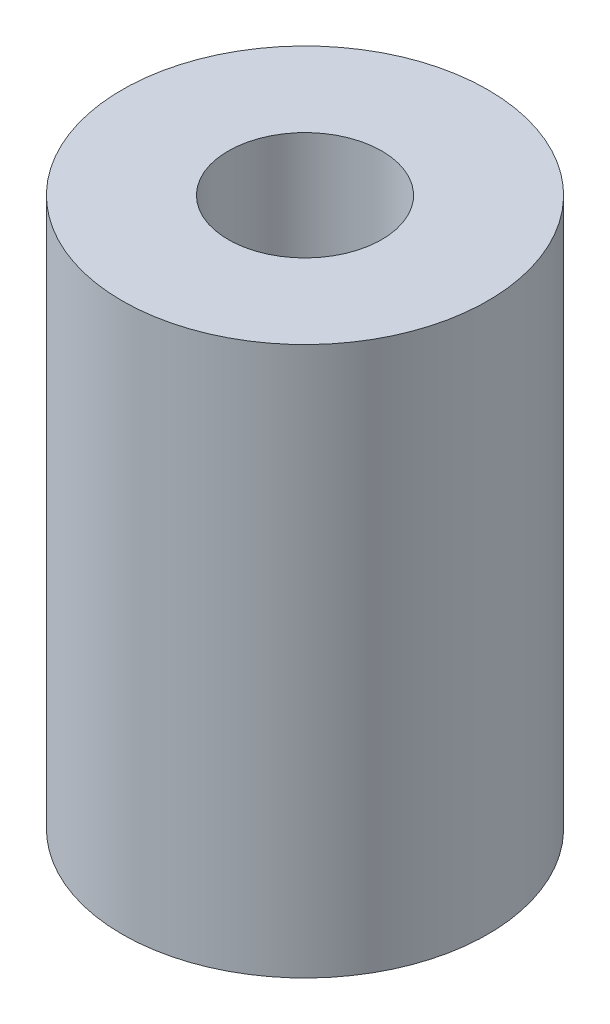
ISO-10303-21;
HEADER;
FILE_DESCRIPTION(('STEP AP214'),'2;1');
FILE_NAME('part.step','',(''),(''),'','','');
FILE_SCHEMA(('AUTOMOTIVE_DESIGN { 1 0 10303 214 1 1 1 1 }'));
ENDSEC;
DATA;
#1=APPLICATION_CONTEXT('core data for automotive mechanical design processes');
#2=APPLICATION_PROTOCOL_DEFINITION('international standard','automotive_design',2000,#1);
#3=PRODUCT_CONTEXT('',#1,'mechanical');
#4=PRODUCT('Part','Part','',(#3));
#5=PRODUCT_RELATED_PRODUCT_CATEGORY('part','',(#4));
#6=PRODUCT_DEFINITION_FORMATION('','',#4);
#7=PRODUCT_DEFINITION_CONTEXT('part definition',#1,'design');
#8=PRODUCT_DEFINITION('design','',#6,#7);
#9=PRODUCT_DEFINITION_SHAPE('','',#8);
#10=(LENGTH_UNIT() NAMED_UNIT(*) SI_UNIT(.MILLI.,.METRE.));
#11=(NAMED_UNIT(*) PLANE_ANGLE_UNIT() SI_UNIT($,.RADIAN.));
#12=(NAMED_UNIT(*) SI_UNIT($,.STERADIAN.) SOLID_ANGLE_UNIT());
#13=UNCERTAINTY_MEASURE_WITH_UNIT(LENGTH_MEASURE(1.E-05),#10,'distance_accuracy_value','');
#14=(GEOMETRIC_REPRESENTATION_CONTEXT(3) GLOBAL_UNCERTAINTY_ASSIGNED_CONTEXT((#13)) GLOBAL_UNIT_ASSIGNED_CONTEXT((#10,
#11,#12)) REPRESENTATION_CONTEXT('',''));
#15=CARTESIAN_POINT('',(0.,0.,0.));
#16=DIRECTION('',(0.,0.,1.));
#17=DIRECTION('',(1.,0.,0.));
#18=AXIS2_PLACEMENT_3D('',#15,#16,#17);
#19=CARTESIAN_POINT('',(0.,19.05,0.));
#20=DIRECTION('',(0.,1.,0.));
#21=DIRECTION('',(0.,0.,1.));
#22=AXIS2_PLACEMENT_3D('',#19,#20,#21);
#23=PLANE('',#22);
#24=CARTESIAN_POINT('',(0.,19.05,0.));
#25=DIRECTION('',(0.,1.,0.));
#26=DIRECTION('',(0.,0.,1.));
#27=AXIS2_PLACEMENT_3D('',#24,#25,#26);
#28=CIRCLE('',#27,6.35);
#29=CARTESIAN_POINT('',(0.,19.05,-6.35));
#30=VERTEX_POINT('',#29);
#31=EDGE_CURVE('E10',#30,#30,#28,.T.);
#32=ORIENTED_EDGE('',*,*,#31,.T.);
#33=EDGE_LOOP('',(#32));
#34=FACE_BOUND('',#33,.T.);
#35=CARTESIAN_POINT('',(0.,19.05,0.));
#36=DIRECTION('',(0.,1.,0.));
#37=DIRECTION('',(0.,0.,1.));
#38=AXIS2_PLACEMENT_3D('',#35,#36,#37);
#39=CIRCLE('',#38,2.667);
#40=CARTESIAN_POINT('',(0.,19.05,-2.667));
#41=VERTEX_POINT('',#40);
#42=EDGE_CURVE('E46',#41,#41,#39,.T.);
#43=ORIENTED_EDGE('',*,*,#42,.F.);
#44=EDGE_LOOP('',(#43));
#45=FACE_BOUND('',#44,.T.);
#46=ADVANCED_FACE('F35',(#34,#45),#23,.T.);
#47=CARTESIAN_POINT('',(0.,0.,0.));
#48=DIRECTION('',(0.,1.,0.));
#49=DIRECTION('',(0.,0.,1.));
#50=AXIS2_PLACEMENT_3D('',#47,#48,#49);
#51=PLANE('',#50);
#52=CARTESIAN_POINT('',(0.,0.,0.));
#53=DIRECTION('',(0.,1.,0.));
#54=DIRECTION('',(0.,0.,1.));
#55=AXIS2_PLACEMENT_3D('',#52,#53,#54);
#56=CIRCLE('',#55,6.35);
#57=CARTESIAN_POINT('',(0.,0.,-6.35));
#58=VERTEX_POINT('',#57);
#59=EDGE_CURVE('E39',#58,#58,#56,.T.);
#60=ORIENTED_EDGE('',*,*,#59,.F.);
#61=EDGE_LOOP('',(#60));
#62=FACE_BOUND('',#61,.T.);
#63=CARTESIAN_POINT('',(0.,0.,0.));
#64=DIRECTION('',(0.,1.,0.));
#65=DIRECTION('',(0.,0.,1.));
#66=AXIS2_PLACEMENT_3D('',#63,#64,#65);
#67=CIRCLE('',#66,2.667);
#68=CARTESIAN_POINT('',(0.,0.,-2.667));
#69=VERTEX_POINT('',#68);
#70=EDGE_CURVE('E48',#69,#69,#67,.T.);
#71=ORIENTED_EDGE('',*,*,#70,.T.);
#72=EDGE_LOOP('',(#71));
#73=FACE_BOUND('',#72,.T.);
#74=ADVANCED_FACE('F58',(#62,#73),#51,.F.);
#75=CARTESIAN_POINT('',(0.,19.05,0.));
#76=DIRECTION('',(0.,-1.,0.));
#77=DIRECTION('',(0.,0.,-1.));
#78=AXIS2_PLACEMENT_3D('',#75,#76,#77);
#79=CYLINDRICAL_SURFACE('',#78,6.35);
#80=CARTESIAN_POINT('',(0.,19.05,-6.35));
#81=CARTESIAN_POINT('',(0.,18.8515625,-6.35));
#82=CARTESIAN_POINT('',(0.,18.653125,-6.35));
#83=CARTESIAN_POINT('',(0.,18.25625,-6.35));
#84=CARTESIAN_POINT('',(0.,18.0578125,-6.35));
#85=CARTESIAN_POINT('',(0.,17.6609375,-6.35));
#86=CARTESIAN_POINT('',(0.,17.4625,-6.35));
#87=CARTESIAN_POINT('',(0.,17.065625,-6.35));
#88=CARTESIAN_POINT('',(0.,16.8671875,-6.35));
#89=CARTESIAN_POINT('',(0.,16.4703125,-6.35));
#90=CARTESIAN_POINT('',(0.,16.271875,-6.35));
#91=CARTESIAN_POINT('',(0.,15.875,-6.35));
#92=CARTESIAN_POINT('',(0.,15.6765625,-6.35));
#93=CARTESIAN_POINT('',(0.,15.2796875,-6.35));
#94=CARTESIAN_POINT('',(0.,15.08125,-6.35));
#95=CARTESIAN_POINT('',(0.,14.684375,-6.35));
#96=CARTESIAN_POINT('',(0.,14.4859375,-6.35));
#97=CARTESIAN_POINT('',(0.,14.0890625,-6.35));
#98=CARTESIAN_POINT('',(0.,13.890625,-6.35));
#99=CARTESIAN_POINT('',(0.,13.49375,-6.35));
#100=CARTESIAN_POINT('',(0.,13.2953125,-6.35));
#101=CARTESIAN_POINT('',(0.,12.8984375,-6.35));
#102=CARTESIAN_POINT('',(0.,12.7,-6.35));
#103=CARTESIAN_POINT('',(0.,12.303125,-6.35));
#104=CARTESIAN_POINT('',(0.,12.1046875,-6.35));
#105=CARTESIAN_POINT('',(0.,11.7078125,-6.35));
#106=CARTESIAN_POINT('',(0.,11.509375,-6.35));
#107=CARTESIAN_POINT('',(0.,11.1125,-6.35));
#108=CARTESIAN_POINT('',(0.,10.9140625,-6.35));
#109=CARTESIAN_POINT('',(0.,10.5171875,-6.35));
#110=CARTESIAN_POINT('',(0.,10.31875,-6.35));
#111=CARTESIAN_POINT('',(0.,9.921875,-6.35));
#112=CARTESIAN_POINT('',(0.,9.7234375,-6.35));
#113=CARTESIAN_POINT('',(0.,9.3265625,-6.35));
#114=CARTESIAN_POINT('',(0.,9.128125,-6.35));
#115=CARTESIAN_POINT('',(0.,8.73125,-6.35));
#116=CARTESIAN_POINT('',(0.,8.5328125,-6.35));
#117=CARTESIAN_POINT('',(0.,8.1359375,-6.35));
#118=CARTESIAN_POINT('',(0.,7.9375,-6.35));
#119=CARTESIAN_POINT('',(0.,7.540625,-6.35));
#120=CARTESIAN_POINT('',(0.,7.3421875,-6.35));
#121=CARTESIAN_POINT('',(0.,6.9453125,-6.35));
#122=CARTESIAN_POINT('',(0.,6.746875,-6.35));
#123=CARTESIAN_POINT('',(0.,6.35,-6.35));
#124=CARTESIAN_POINT('',(0.,6.1515625,-6.35));
#125=CARTESIAN_POINT('',(0.,5.7546875,-6.35));
#126=CARTESIAN_POINT('',(0.,5.55625,-6.35));
#127=CARTESIAN_POINT('',(0.,5.159375,-6.35));
#128=CARTESIAN_POINT('',(0.,4.9609375,-6.35));
#129=CARTESIAN_POINT('',(0.,4.5640625,-6.35));
#130=CARTESIAN_POINT('',(0.,4.365625,-6.35));
#131=CARTESIAN_POINT('',(0.,3.96875,-6.35));
#132=CARTESIAN_POINT('',(0.,3.7703125,-6.35));
#133=CARTESIAN_POINT('',(0.,3.3734375,-6.35));
#134=CARTESIAN_POINT('',(0.,3.175,-6.35));
#135=CARTESIAN_POINT('',(0.,2.778125,-6.35));
#136=CARTESIAN_POINT('',(0.,2.5796875,-6.35));
#137=CARTESIAN_POINT('',(0.,2.1828125,-6.35));
#138=CARTESIAN_POINT('',(0.,1.984375,-6.35));
#139=CARTESIAN_POINT('',(0.,1.5875,-6.35));
#140=CARTESIAN_POINT('',(0.,1.3890625,-6.35));
#141=CARTESIAN_POINT('',(0.,0.992187500000001,-6.35));
#142=CARTESIAN_POINT('',(0.,0.793750000000001,-6.35));
#143=CARTESIAN_POINT('',(0.,0.396875,-6.35));
#144=CARTESIAN_POINT('',(0.,0.1984375,-6.35));
#145=CARTESIAN_POINT('',(0.,0.,-6.35));
#146=B_SPLINE_CURVE_WITH_KNOTS('',3,(#80,#81,#82,#83,#84,#85,#86,#87,#88,#89,#90,#91,#92,#93,
#94,#95,#96,#97,#98,#99,#100,#101,#102,#103,#104,#105,#106,#107,#108,#109,#110,#111,#112,#113,
#114,#115,#116,#117,#118,#119,#120,#121,#122,#123,#124,#125,#126,#127,#128,#129,#130,#131,#132,
#133,#134,#135,#136,#137,#138,#139,#140,#141,#142,#143,#144,#145),.UNSPECIFIED.,.F.,.F.,(4,2,2,
2,2,2,2,2,2,2,2,2,2,2,2,2,2,2,2,2,2,2,2,2,2,2,2,2,2,2,2,2,4),(0.,0.5953125,1.190625,1.7859375,
2.38125,2.9765625,3.571875,4.1671875,4.7625,5.3578125,5.953125,6.5484375,7.14375,7.7390625,
8.334375,8.9296875,9.525,10.1203125,10.715625,11.3109375,11.90625,12.5015625,13.096875,
13.6921875,14.2875,14.8828125,15.478125,16.0734375,16.66875,17.2640625,17.859375,18.4546875,
19.05),.UNSPECIFIED.);
#147=EDGE_CURVE('BSEAM37',#30,#58,#146,.T.);
#148=ORIENTED_EDGE('',*,*,#31,.F.);
#149=ORIENTED_EDGE('',*,*,#59,.T.);
#150=ORIENTED_EDGE('',*,*,#147,.T.);
#151=ORIENTED_EDGE('',*,*,#147,.F.);
#152=EDGE_LOOP('',(#148,#150,#149,#151));
#153=FACE_BOUND('',#152,.T.);
#154=ADVANCED_FACE('F37',(#153),#79,.T.);
#155=CARTESIAN_POINT('',(0.,19.05,0.));
#156=DIRECTION('',(0.,-1.,0.));
#157=DIRECTION('',(0.,0.,-1.));
#158=AXIS2_PLACEMENT_3D('',#155,#156,#157);
#159=CYLINDRICAL_SURFACE('',#158,2.667);
#160=CARTESIAN_POINT('',(0.,19.05,-2.667));
#161=CARTESIAN_POINT('',(0.,18.8515625,-2.667));
#162=CARTESIAN_POINT('',(0.,18.653125,-2.667));
#163=CARTESIAN_POINT('',(0.,18.25625,-2.667));
#164=CARTESIAN_POINT('',(0.,18.0578125,-2.667));
#165=CARTESIAN_POINT('',(0.,17.6609375,-2.667));
#166=CARTESIAN_POINT('',(0.,17.4625,-2.667));
#167=CARTESIAN_POINT('',(0.,17.065625,-2.667));
#168=CARTESIAN_POINT('',(0.,16.8671875,-2.667));
#169=CARTESIAN_POINT('',(0.,16.4703125,-2.667));
#170=CARTESIAN_POINT('',(0.,16.271875,-2.667));
#171=CARTESIAN_POINT('',(0.,15.875,-2.667));
#172=CARTESIAN_POINT('',(0.,15.6765625,-2.667));
#173=CARTESIAN_POINT('',(0.,15.2796875,-2.667));
#174=CARTESIAN_POINT('',(0.,15.08125,-2.667));
#175=CARTESIAN_POINT('',(0.,14.684375,-2.667));
#176=CARTESIAN_POINT('',(0.,14.4859375,-2.667));
#177=CARTESIAN_POINT('',(0.,14.0890625,-2.667));
#178=CARTESIAN_POINT('',(0.,13.890625,-2.667));
#179=CARTESIAN_POINT('',(0.,13.49375,-2.667));
#180=CARTESIAN_POINT('',(0.,13.2953125,-2.667));
#181=CARTESIAN_POINT('',(0.,12.8984375,-2.667));
#182=CARTESIAN_POINT('',(0.,12.7,-2.667));
#183=CARTESIAN_POINT('',(0.,12.303125,-2.667));
#184=CARTESIAN_POINT('',(0.,12.1046875,-2.667));
#185=CARTESIAN_POINT('',(0.,11.7078125,-2.667));
#186=CARTESIAN_POINT('',(0.,11.509375,-2.667));
#187=CARTESIAN_POINT('',(0.,11.1125,-2.667));
#188=CARTESIAN_POINT('',(0.,10.9140625,-2.667));
#189=CARTESIAN_POINT('',(0.,10.5171875,-2.667));
#190=CARTESIAN_POINT('',(0.,10.31875,-2.667));
#191=CARTESIAN_POINT('',(0.,9.921875,-2.667));
#192=CARTESIAN_POINT('',(0.,9.7234375,-2.667));
#193=CARTESIAN_POINT('',(0.,9.3265625,-2.667));
#194=CARTESIAN_POINT('',(0.,9.128125,-2.667));
#195=CARTESIAN_POINT('',(0.,8.73125,-2.667));
#196=CARTESIAN_POINT('',(0.,8.5328125,-2.667));
#197=CARTESIAN_POINT('',(0.,8.1359375,-2.667));
#198=CARTESIAN_POINT('',(0.,7.9375,-2.667));
#199=CARTESIAN_POINT('',(0.,7.540625,-2.667));
#200=CARTESIAN_POINT('',(0.,7.3421875,-2.667));
#201=CARTESIAN_POINT('',(0.,6.9453125,-2.667));
#202=CARTESIAN_POINT('',(0.,6.746875,-2.667));
#203=CARTESIAN_POINT('',(0.,6.35,-2.667));
#204=CARTESIAN_POINT('',(0.,6.1515625,-2.667));
#205=CARTESIAN_POINT('',(0.,5.7546875,-2.667));
#206=CARTESIAN_POINT('',(0.,5.55625,-2.667));
#207=CARTESIAN_POINT('',(0.,5.159375,-2.667));
#208=CARTESIAN_POINT('',(0.,4.9609375,-2.667));
#209=CARTESIAN_POINT('',(0.,4.5640625,-2.667));
#210=CARTESIAN_POINT('',(0.,4.365625,-2.667));
#211=CARTESIAN_POINT('',(0.,3.96875,-2.667));
#212=CARTESIAN_POINT('',(0.,3.7703125,-2.667));
#213=CARTESIAN_POINT('',(0.,3.3734375,-2.667));
#214=CARTESIAN_POINT('',(0.,3.175,-2.667));
#215=CARTESIAN_POINT('',(0.,2.778125,-2.667));
#216=CARTESIAN_POINT('',(0.,2.5796875,-2.667));
#217=CARTESIAN_POINT('',(0.,2.1828125,-2.667));
#218=CARTESIAN_POINT('',(0.,1.984375,-2.667));
#219=CARTESIAN_POINT('',(0.,1.5875,-2.667));
#220=CARTESIAN_POINT('',(0.,1.3890625,-2.667));
#221=CARTESIAN_POINT('',(0.,0.992187500000001,-2.667));
#222=CARTESIAN_POINT('',(0.,0.793750000000001,-2.667));
#223=CARTESIAN_POINT('',(0.,0.396875,-2.667));
#224=CARTESIAN_POINT('',(0.,0.1984375,-2.667));
#225=CARTESIAN_POINT('',(0.,0.,-2.667));
#226=B_SPLINE_CURVE_WITH_KNOTS('',3,(#160,#161,#162,#163,#164,#165,#166,#167,#168,#169,#170,
#171,#172,#173,#174,#175,#176,#177,#178,#179,#180,#181,#182,#183,#184,#185,#186,#187,#188,#189,
#190,#191,#192,#193,#194,#195,#196,#197,#198,#199,#200,#201,#202,#203,#204,#205,#206,#207,#208,
#209,#210,#211,#212,#213,#214,#215,#216,#217,#218,#219,#220,#221,#222,#223,#224,#225),
.UNSPECIFIED.,.F.,.F.,(4,2,2,2,2,2,2,2,2,2,2,2,2,2,2,2,2,2,2,2,2,2,2,2,2,2,2,2,2,2,2,2,4),(0.,
0.5953125,1.190625,1.7859375,2.38125,2.9765625,3.571875,4.1671875,4.7625,5.3578125,5.953125,
6.5484375,7.14375,7.7390625,8.334375,8.9296875,9.525,10.1203125,10.715625,11.3109375,11.90625,
12.5015625,13.096875,13.6921875,14.2875,14.8828125,15.478125,16.0734375,16.66875,17.2640625,
17.859375,18.4546875,19.05),.UNSPECIFIED.);
#227=EDGE_CURVE('BSEAM54',#41,#69,#226,.T.);
#228=ORIENTED_EDGE('',*,*,#42,.T.);
#229=ORIENTED_EDGE('',*,*,#70,.F.);
#230=ORIENTED_EDGE('',*,*,#227,.T.);
#231=ORIENTED_EDGE('',*,*,#227,.F.);
#232=EDGE_LOOP('',(#228,#230,#229,#231));
#233=FACE_BOUND('',#232,.T.);
#234=ADVANCED_FACE('F54',(#233),#159,.F.);
#235=CLOSED_SHELL('',(#46,#74,#154,#234));
#236=MANIFOLD_SOLID_BREP('B2',#235);
#237=ADVANCED_BREP_SHAPE_REPRESENTATION('',(#18,#236),#14);
#238=SHAPE_DEFINITION_REPRESENTATION(#9,#237);
ENDSEC;
END-ISO-10303-21;
